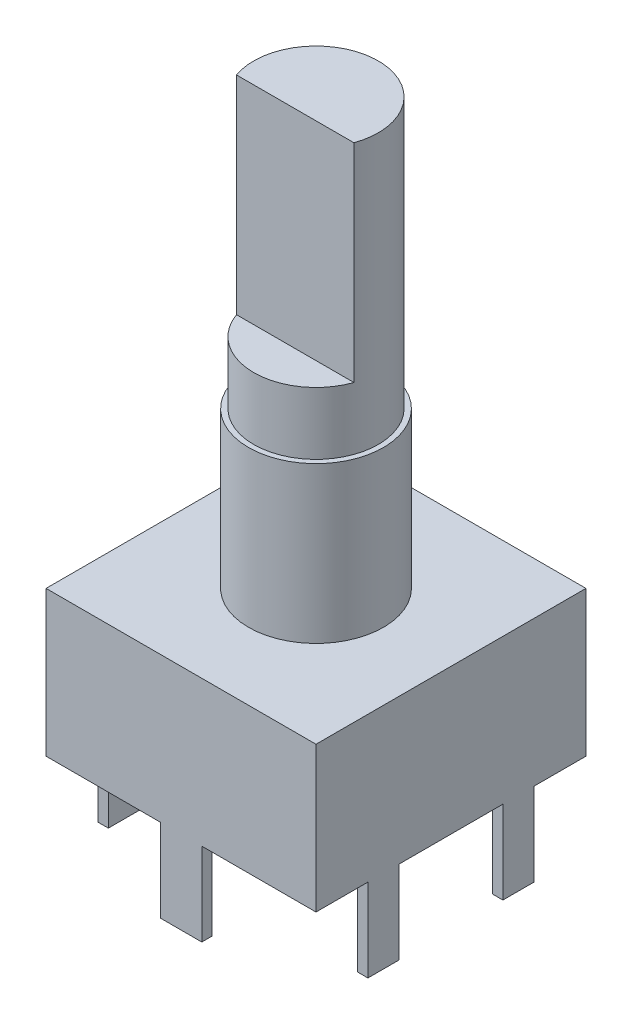
ISO-10303-21;
HEADER;
FILE_DESCRIPTION(('STEP AP214'),'2;1');
FILE_NAME('part.step','',(''),(''),'','','');
FILE_SCHEMA(('AUTOMOTIVE_DESIGN { 1 0 10303 214 1 1 1 1 }'));
ENDSEC;
DATA;
#1=APPLICATION_CONTEXT('core data for automotive mechanical design processes');
#2=APPLICATION_PROTOCOL_DEFINITION('international standard','automotive_design',2000,#1);
#3=PRODUCT_CONTEXT('',#1,'mechanical');
#4=PRODUCT('Part','Part','',(#3));
#5=PRODUCT_RELATED_PRODUCT_CATEGORY('part','',(#4));
#6=PRODUCT_DEFINITION_FORMATION('','',#4);
#7=PRODUCT_DEFINITION_CONTEXT('part definition',#1,'design');
#8=PRODUCT_DEFINITION('design','',#6,#7);
#9=PRODUCT_DEFINITION_SHAPE('','',#8);
#10=(LENGTH_UNIT() NAMED_UNIT(*) SI_UNIT(.MILLI.,.METRE.));
#11=(NAMED_UNIT(*) PLANE_ANGLE_UNIT() SI_UNIT($,.RADIAN.));
#12=(NAMED_UNIT(*) SI_UNIT($,.STERADIAN.) SOLID_ANGLE_UNIT());
#13=UNCERTAINTY_MEASURE_WITH_UNIT(LENGTH_MEASURE(1.E-05),#10,'distance_accuracy_value','');
#14=(GEOMETRIC_REPRESENTATION_CONTEXT(3) GLOBAL_UNCERTAINTY_ASSIGNED_CONTEXT((#13)) GLOBAL_UNIT_ASSIGNED_CONTEXT((#10,
#11,#12)) REPRESENTATION_CONTEXT('',''));
#15=CARTESIAN_POINT('',(0.,0.,0.));
#16=DIRECTION('',(0.,0.,1.));
#17=DIRECTION('',(1.,0.,0.));
#18=AXIS2_PLACEMENT_3D('',#15,#16,#17);
#19=CARTESIAN_POINT('',(-6.,14.5,6.));
#20=DIRECTION('',(0.,1.,0.));
#21=DIRECTION('',(0.,0.,1.));
#22=AXIS2_PLACEMENT_3D('',#19,#20,#21);
#23=PLANE('',#22);
#24=CARTESIAN_POINT('',(-6.,14.5,6.));
#25=DIRECTION('',(0.,1.,0.));
#26=DIRECTION('',(0.,0.,1.));
#27=AXIS2_PLACEMENT_3D('',#24,#25,#26);
#28=CIRCLE('',#27,3.25);
#29=CARTESIAN_POINT('',(-6.,14.5,9.25));
#30=VERTEX_POINT('',#29);
#31=EDGE_CURVE('E281',#30,#30,#28,.T.);
#32=ORIENTED_EDGE('',*,*,#31,.T.);
#33=EDGE_LOOP('',(#32));
#34=FACE_BOUND('',#33,.T.);
#35=CARTESIAN_POINT('',(-6.,14.5,6.));
#36=DIRECTION('',(0.,1.,0.));
#37=DIRECTION('',(0.,0.,1.));
#38=AXIS2_PLACEMENT_3D('',#35,#36,#37);
#39=CIRCLE('',#38,3.);
#40=CARTESIAN_POINT('',(-6.,14.5,9.));
#41=VERTEX_POINT('',#40);
#42=EDGE_CURVE('E273',#41,#41,#39,.T.);
#43=ORIENTED_EDGE('',*,*,#42,.F.);
#44=EDGE_LOOP('',(#43));
#45=FACE_BOUND('',#44,.T.);
#46=ADVANCED_FACE('F33',(#34,#45),#23,.T.);
#47=CARTESIAN_POINT('',(-12.,7.,12.));
#48=DIRECTION('',(0.,1.,0.));
#49=DIRECTION('',(0.,0.,1.));
#50=AXIS2_PLACEMENT_3D('',#47,#48,#49);
#51=PLANE('',#50);
#52=DIRECTION('',(0.,0.,-1.));
#53=VECTOR('',#52,1.);
#54=CARTESIAN_POINT('',(0.500000000000002,7.,12.5));
#55=LINE('',#54,#53);
#56=CARTESIAN_POINT('',(0.500000000000002,7.,12.5));
#57=VERTEX_POINT('',#56);
#58=CARTESIAN_POINT('',(0.500000000000002,7.,-0.5));
#59=VERTEX_POINT('',#58);
#60=EDGE_CURVE('E529',#57,#59,#55,.T.);
#61=ORIENTED_EDGE('',*,*,#60,.T.);
#62=DIRECTION('',(-1.,0.,0.));
#63=VECTOR('',#62,1.);
#64=CARTESIAN_POINT('',(0.500000000000002,7.,-0.5));
#65=LINE('',#64,#63);
#66=CARTESIAN_POINT('',(-12.5,7.,-0.5));
#67=VERTEX_POINT('',#66);
#68=EDGE_CURVE('E526',#59,#67,#65,.T.);
#69=ORIENTED_EDGE('',*,*,#68,.T.);
#70=DIRECTION('',(0.,0.,1.));
#71=VECTOR('',#70,1.);
#72=CARTESIAN_POINT('',(-12.5,7.,-0.5));
#73=LINE('',#72,#71);
#74=CARTESIAN_POINT('',(-12.5,7.,12.5));
#75=VERTEX_POINT('',#74);
#76=EDGE_CURVE('E523',#67,#75,#73,.T.);
#77=ORIENTED_EDGE('',*,*,#76,.T.);
#78=DIRECTION('',(1.,0.,0.));
#79=VECTOR('',#78,1.);
#80=CARTESIAN_POINT('',(-12.5,7.,12.5));
#81=LINE('',#80,#79);
#82=EDGE_CURVE('E515',#75,#57,#81,.T.);
#83=ORIENTED_EDGE('',*,*,#82,.T.);
#84=EDGE_LOOP('',(#61,#69,#77,#83));
#85=FACE_BOUND('',#84,.T.);
#86=CARTESIAN_POINT('',(-6.,7.,6.));
#87=DIRECTION('',(0.,1.,0.));
#88=DIRECTION('',(0.,0.,1.));
#89=AXIS2_PLACEMENT_3D('',#86,#87,#88);
#90=CIRCLE('',#89,3.25);
#91=CARTESIAN_POINT('',(-6.,7.,9.25));
#92=VERTEX_POINT('',#91);
#93=EDGE_CURVE('E278',#92,#92,#90,.T.);
#94=ORIENTED_EDGE('',*,*,#93,.F.);
#95=EDGE_LOOP('',(#94));
#96=FACE_BOUND('',#95,.T.);
#97=ADVANCED_FACE('F552',(#85,#96),#51,.T.);
#98=CARTESIAN_POINT('',(-12.,0.,12.));
#99=DIRECTION('',(0.,1.,0.));
#100=DIRECTION('',(0.,0.,1.));
#101=AXIS2_PLACEMENT_3D('',#98,#99,#100);
#102=PLANE('',#101);
#103=DIRECTION('',(0.,0.,-1.));
#104=VECTOR('',#103,1.);
#105=CARTESIAN_POINT('',(-7.,0.,0.));
#106=LINE('',#105,#104);
#107=CARTESIAN_POINT('',(-7.,0.,0.));
#108=VERTEX_POINT('',#107);
#109=CARTESIAN_POINT('',(-7.,0.,-0.5));
#110=VERTEX_POINT('',#109);
#111=EDGE_CURVE('E58',#108,#110,#106,.T.);
#112=ORIENTED_EDGE('',*,*,#111,.F.);
#113=DIRECTION('',(-1.,0.,0.));
#114=VECTOR('',#113,1.);
#115=CARTESIAN_POINT('',(-7.,0.,0.));
#116=LINE('',#115,#114);
#117=CARTESIAN_POINT('',(-5.,0.,0.));
#118=VERTEX_POINT('',#117);
#119=EDGE_CURVE('E290',#118,#108,#116,.T.);
#120=ORIENTED_EDGE('',*,*,#119,.F.);
#121=DIRECTION('',(0.,0.,1.));
#122=VECTOR('',#121,1.);
#123=CARTESIAN_POINT('',(-5.,0.,0.));
#124=LINE('',#123,#122);
#125=CARTESIAN_POINT('',(-5.,0.,-0.499999999999998));
#126=VERTEX_POINT('',#125);
#127=EDGE_CURVE('E298',#126,#118,#124,.T.);
#128=ORIENTED_EDGE('',*,*,#127,.F.);
#129=DIRECTION('',(1.,0.,0.));
#130=VECTOR('',#129,1.);
#131=CARTESIAN_POINT('',(0.500000000000002,0.,-0.5));
#132=LINE('',#131,#130);
#133=CARTESIAN_POINT('',(0.500000000000002,0.,-0.5));
#134=VERTEX_POINT('',#133);
#135=EDGE_CURVE('E43',#126,#134,#132,.T.);
#136=ORIENTED_EDGE('',*,*,#135,.T.);
#137=DIRECTION('',(0.,0.,1.));
#138=VECTOR('',#137,1.);
#139=CARTESIAN_POINT('',(0.500000000000002,0.,12.5));
#140=LINE('',#139,#138);
#141=CARTESIAN_POINT('',(0.500000000000002,0.,2.));
#142=VERTEX_POINT('',#141);
#143=EDGE_CURVE('E531',#134,#142,#140,.T.);
#144=ORIENTED_EDGE('',*,*,#143,.T.);
#145=DIRECTION('',(1.,0.,0.));
#146=VECTOR('',#145,1.);
#147=CARTESIAN_POINT('',(0.,0.,2.));
#148=LINE('',#147,#146);
#149=CARTESIAN_POINT('',(0.,0.,2.));
#150=VERTEX_POINT('',#149);
#151=EDGE_CURVE('E318',#150,#142,#148,.T.);
#152=ORIENTED_EDGE('',*,*,#151,.F.);
#153=DIRECTION('',(0.,0.,-1.));
#154=VECTOR('',#153,1.);
#155=CARTESIAN_POINT('',(0.,0.,2.));
#156=LINE('',#155,#154);
#157=CARTESIAN_POINT('',(0.,0.,3.5));
#158=VERTEX_POINT('',#157);
#159=EDGE_CURVE('E327',#158,#150,#156,.T.);
#160=ORIENTED_EDGE('',*,*,#159,.F.);
#161=DIRECTION('',(-1.,0.,0.));
#162=VECTOR('',#161,1.);
#163=CARTESIAN_POINT('',(0.5,0.,3.5));
#164=LINE('',#163,#162);
#165=CARTESIAN_POINT('',(0.5,0.,3.5));
#166=VERTEX_POINT('',#165);
#167=EDGE_CURVE('E313',#166,#158,#164,.T.);
#168=ORIENTED_EDGE('',*,*,#167,.F.);
#169=CARTESIAN_POINT('',(0.500000000000002,0.,8.5));
#170=VERTEX_POINT('',#169);
#171=EDGE_CURVE('E532',#166,#170,#140,.T.);
#172=ORIENTED_EDGE('',*,*,#171,.T.);
#173=DIRECTION('',(1.,0.,0.));
#174=VECTOR('',#173,1.);
#175=CARTESIAN_POINT('',(0.,0.,8.5));
#176=LINE('',#175,#174);
#177=CARTESIAN_POINT('',(0.,0.,8.5));
#178=VERTEX_POINT('',#177);
#179=EDGE_CURVE('E387',#178,#170,#176,.T.);
#180=ORIENTED_EDGE('',*,*,#179,.F.);
#181=DIRECTION('',(0.,0.,-1.));
#182=VECTOR('',#181,1.);
#183=CARTESIAN_POINT('',(0.,0.,8.5));
#184=LINE('',#183,#182);
#185=CARTESIAN_POINT('',(0.,0.,10.));
#186=VERTEX_POINT('',#185);
#187=EDGE_CURVE('E373',#186,#178,#184,.T.);
#188=ORIENTED_EDGE('',*,*,#187,.F.);
#189=DIRECTION('',(-1.,0.,0.));
#190=VECTOR('',#189,1.);
#191=CARTESIAN_POINT('',(0.,0.,10.));
#192=LINE('',#191,#190);
#193=CARTESIAN_POINT('',(0.5,0.,10.));
#194=VERTEX_POINT('',#193);
#195=EDGE_CURVE('E378',#194,#186,#192,.T.);
#196=ORIENTED_EDGE('',*,*,#195,.F.);
#197=CARTESIAN_POINT('',(0.500000000000002,0.,12.5));
#198=VERTEX_POINT('',#197);
#199=EDGE_CURVE('E533',#194,#198,#140,.T.);
#200=ORIENTED_EDGE('',*,*,#199,.T.);
#201=DIRECTION('',(-1.,0.,0.));
#202=VECTOR('',#201,1.);
#203=CARTESIAN_POINT('',(-12.5,0.,12.5));
#204=LINE('',#203,#202);
#205=CARTESIAN_POINT('',(-5.,0.,12.5));
#206=VERTEX_POINT('',#205);
#207=EDGE_CURVE('E504',#198,#206,#204,.T.);
#208=ORIENTED_EDGE('',*,*,#207,.T.);
#209=DIRECTION('',(0.,0.,1.));
#210=VECTOR('',#209,1.);
#211=CARTESIAN_POINT('',(-5.,0.,12.5));
#212=LINE('',#211,#210);
#213=CARTESIAN_POINT('',(-5.,0.,12.));
#214=VERTEX_POINT('',#213);
#215=EDGE_CURVE('E348',#214,#206,#212,.T.);
#216=ORIENTED_EDGE('',*,*,#215,.F.);
#217=DIRECTION('',(1.,0.,0.));
#218=VECTOR('',#217,1.);
#219=CARTESIAN_POINT('',(-5.,0.,12.));
#220=LINE('',#219,#218);
#221=CARTESIAN_POINT('',(-7.,0.,12.));
#222=VERTEX_POINT('',#221);
#223=EDGE_CURVE('E357',#222,#214,#220,.T.);
#224=ORIENTED_EDGE('',*,*,#223,.F.);
#225=DIRECTION('',(0.,0.,-1.));
#226=VECTOR('',#225,1.);
#227=CARTESIAN_POINT('',(-7.,0.,12.5));
#228=LINE('',#227,#226);
#229=CARTESIAN_POINT('',(-7.,0.,12.5));
#230=VERTEX_POINT('',#229);
#231=EDGE_CURVE('E343',#230,#222,#228,.T.);
#232=ORIENTED_EDGE('',*,*,#231,.F.);
#233=CARTESIAN_POINT('',(-12.5,0.,12.5));
#234=VERTEX_POINT('',#233);
#235=EDGE_CURVE('E511',#230,#234,#204,.T.);
#236=ORIENTED_EDGE('',*,*,#235,.T.);
#237=DIRECTION('',(0.,0.,-1.));
#238=VECTOR('',#237,1.);
#239=CARTESIAN_POINT('',(-12.5,0.,-0.5));
#240=LINE('',#239,#238);
#241=CARTESIAN_POINT('',(-12.5,0.,10.));
#242=VERTEX_POINT('',#241);
#243=EDGE_CURVE('E509',#234,#242,#240,.T.);
#244=ORIENTED_EDGE('',*,*,#243,.T.);
#245=DIRECTION('',(-1.,0.,0.));
#246=VECTOR('',#245,1.);
#247=CARTESIAN_POINT('',(-12.,0.,10.));
#248=LINE('',#247,#246);
#249=CARTESIAN_POINT('',(-12.,0.,10.));
#250=VERTEX_POINT('',#249);
#251=EDGE_CURVE('E477',#250,#242,#248,.T.);
#252=ORIENTED_EDGE('',*,*,#251,.F.);
#253=DIRECTION('',(0.,0.,1.));
#254=VECTOR('',#253,1.);
#255=CARTESIAN_POINT('',(-12.,0.,10.));
#256=LINE('',#255,#254);
#257=CARTESIAN_POINT('',(-12.,0.,8.5));
#258=VERTEX_POINT('',#257);
#259=EDGE_CURVE('E463',#258,#250,#256,.T.);
#260=ORIENTED_EDGE('',*,*,#259,.F.);
#261=DIRECTION('',(1.,0.,0.));
#262=VECTOR('',#261,1.);
#263=CARTESIAN_POINT('',(-12.,0.,8.5));
#264=LINE('',#263,#262);
#265=CARTESIAN_POINT('',(-12.5,0.,8.5));
#266=VERTEX_POINT('',#265);
#267=EDGE_CURVE('E468',#266,#258,#264,.T.);
#268=ORIENTED_EDGE('',*,*,#267,.F.);
#269=CARTESIAN_POINT('',(-12.5,0.,6.793));
#270=VERTEX_POINT('',#269);
#271=EDGE_CURVE('E485',#266,#270,#240,.T.);
#272=ORIENTED_EDGE('',*,*,#271,.T.);
#273=DIRECTION('',(-1.,0.,0.));
#274=VECTOR('',#273,1.);
#275=CARTESIAN_POINT('',(-12.,0.,6.793));
#276=LINE('',#275,#274);
#277=CARTESIAN_POINT('',(-12.,0.,6.793));
#278=VERTEX_POINT('',#277);
#279=EDGE_CURVE('E447',#278,#270,#276,.T.);
#280=ORIENTED_EDGE('',*,*,#279,.F.);
#281=DIRECTION('',(0.,0.,1.));
#282=VECTOR('',#281,1.);
#283=CARTESIAN_POINT('',(-12.,0.,6.793));
#284=LINE('',#283,#282);
#285=CARTESIAN_POINT('',(-12.,0.,5.293));
#286=VERTEX_POINT('',#285);
#287=EDGE_CURVE('E433',#286,#278,#284,.T.);
#288=ORIENTED_EDGE('',*,*,#287,.F.);
#289=DIRECTION('',(1.,0.,0.));
#290=VECTOR('',#289,1.);
#291=CARTESIAN_POINT('',(-12.,0.,5.293));
#292=LINE('',#291,#290);
#293=CARTESIAN_POINT('',(-12.5,0.,5.293));
#294=VERTEX_POINT('',#293);
#295=EDGE_CURVE('E438',#294,#286,#292,.T.);
#296=ORIENTED_EDGE('',*,*,#295,.F.);
#297=CARTESIAN_POINT('',(-12.5,0.,3.5));
#298=VERTEX_POINT('',#297);
#299=EDGE_CURVE('E501',#294,#298,#240,.T.);
#300=ORIENTED_EDGE('',*,*,#299,.T.);
#301=DIRECTION('',(-1.,0.,0.));
#302=VECTOR('',#301,1.);
#303=CARTESIAN_POINT('',(-12.,0.,3.5));
#304=LINE('',#303,#302);
#305=CARTESIAN_POINT('',(-12.,0.,3.5));
#306=VERTEX_POINT('',#305);
#307=EDGE_CURVE('E417',#306,#298,#304,.T.);
#308=ORIENTED_EDGE('',*,*,#307,.F.);
#309=DIRECTION('',(0.,0.,1.));
#310=VECTOR('',#309,1.);
#311=CARTESIAN_POINT('',(-12.,0.,3.5));
#312=LINE('',#311,#310);
#313=CARTESIAN_POINT('',(-12.,0.,2.));
#314=VERTEX_POINT('',#313);
#315=EDGE_CURVE('E403',#314,#306,#312,.T.);
#316=ORIENTED_EDGE('',*,*,#315,.F.);
#317=DIRECTION('',(1.,0.,0.));
#318=VECTOR('',#317,1.);
#319=CARTESIAN_POINT('',(-12.,0.,2.));
#320=LINE('',#319,#318);
#321=CARTESIAN_POINT('',(-12.5,0.,2.));
#322=VERTEX_POINT('',#321);
#323=EDGE_CURVE('E408',#322,#314,#320,.T.);
#324=ORIENTED_EDGE('',*,*,#323,.F.);
#325=CARTESIAN_POINT('',(-12.5,0.,-0.5));
#326=VERTEX_POINT('',#325);
#327=EDGE_CURVE('E37',#322,#326,#240,.T.);
#328=ORIENTED_EDGE('',*,*,#327,.T.);
#329=EDGE_CURVE('E11',#326,#110,#132,.T.);
#330=ORIENTED_EDGE('',*,*,#329,.T.);
#331=EDGE_LOOP('',(#112,#120,#128,#136,#144,#152,#160,#168,#172,#180,#188,#196,#200,#208,#216,
#224,#232,#236,#244,#252,#260,#268,#272,#280,#288,#296,#300,#308,#316,#324,#328,#330));
#332=FACE_BOUND('',#331,.T.);
#333=ADVANCED_FACE('F35',(#332),#102,.F.);
#334=CARTESIAN_POINT('',(0.500000000000002,-18.3847763108502,-0.5));
#335=DIRECTION('',(0.,0.,-1.));
#336=DIRECTION('',(-1.,0.,0.));
#337=AXIS2_PLACEMENT_3D('',#334,#335,#336);
#338=PLANE('',#337);
#339=ORIENTED_EDGE('',*,*,#329,.F.);
#340=DIRECTION('',(0.,1.,0.));
#341=VECTOR('',#340,1.);
#342=CARTESIAN_POINT('',(-12.5,-18.3847763108502,-0.5));
#343=LINE('',#342,#341);
#344=EDGE_CURVE('E514',#326,#67,#343,.T.);
#345=ORIENTED_EDGE('',*,*,#344,.T.);
#346=ORIENTED_EDGE('',*,*,#68,.F.);
#347=DIRECTION('',(0.,1.,0.));
#348=VECTOR('',#347,1.);
#349=CARTESIAN_POINT('',(0.500000000000002,-18.3847763108502,-0.5));
#350=LINE('',#349,#348);
#351=EDGE_CURVE('E512',#134,#59,#350,.T.);
#352=ORIENTED_EDGE('',*,*,#351,.F.);
#353=ORIENTED_EDGE('',*,*,#135,.F.);
#354=DIRECTION('',(0.,1.,0.));
#355=VECTOR('',#354,1.);
#356=CARTESIAN_POINT('',(-5.,-4.,-0.499999999999998));
#357=LINE('',#356,#355);
#358=CARTESIAN_POINT('',(-5.,-4.,-0.499999999999998));
#359=VERTEX_POINT('',#358);
#360=EDGE_CURVE('E307',#359,#126,#357,.T.);
#361=ORIENTED_EDGE('',*,*,#360,.F.);
#362=DIRECTION('',(1.,0.,0.));
#363=VECTOR('',#362,1.);
#364=CARTESIAN_POINT('',(-7.,-4.,-0.499999999999999));
#365=LINE('',#364,#363);
#366=CARTESIAN_POINT('',(-7.,-4.,-0.499999999999999));
#367=VERTEX_POINT('',#366);
#368=EDGE_CURVE('E289',#367,#359,#365,.T.);
#369=ORIENTED_EDGE('',*,*,#368,.F.);
#370=DIRECTION('',(0.,1.,0.));
#371=VECTOR('',#370,1.);
#372=CARTESIAN_POINT('',(-7.,-4.,-0.499999999999999));
#373=LINE('',#372,#371);
#374=EDGE_CURVE('E310',#367,#110,#373,.T.);
#375=ORIENTED_EDGE('',*,*,#374,.T.);
#376=EDGE_LOOP('',(#339,#345,#346,#352,#353,#361,#369,#375));
#377=FACE_BOUND('',#376,.T.);
#378=ADVANCED_FACE('F560',(#377),#338,.T.);
#379=CARTESIAN_POINT('',(-12.5,-18.3847763108502,-0.5));
#380=DIRECTION('',(-1.,0.,0.));
#381=DIRECTION('',(0.,0.,1.));
#382=AXIS2_PLACEMENT_3D('',#379,#380,#381);
#383=PLANE('',#382);
#384=ORIENTED_EDGE('',*,*,#243,.F.);
#385=DIRECTION('',(0.,1.,0.));
#386=VECTOR('',#385,1.);
#387=CARTESIAN_POINT('',(-12.5,-18.3847763108502,12.5));
#388=LINE('',#387,#386);
#389=EDGE_CURVE('E517',#234,#75,#388,.T.);
#390=ORIENTED_EDGE('',*,*,#389,.T.);
#391=ORIENTED_EDGE('',*,*,#76,.F.);
#392=ORIENTED_EDGE('',*,*,#344,.F.);
#393=ORIENTED_EDGE('',*,*,#327,.F.);
#394=DIRECTION('',(0.,1.,0.));
#395=VECTOR('',#394,1.);
#396=CARTESIAN_POINT('',(-12.5,-4.,2.));
#397=LINE('',#396,#395);
#398=CARTESIAN_POINT('',(-12.5,-4.,2.));
#399=VERTEX_POINT('',#398);
#400=EDGE_CURVE('E424',#399,#322,#397,.T.);
#401=ORIENTED_EDGE('',*,*,#400,.F.);
#402=DIRECTION('',(0.,0.,-1.));
#403=VECTOR('',#402,1.);
#404=CARTESIAN_POINT('',(-12.5,-4.,3.5));
#405=LINE('',#404,#403);
#406=CARTESIAN_POINT('',(-12.5,-4.,3.5));
#407=VERTEX_POINT('',#406);
#408=EDGE_CURVE('E410',#407,#399,#405,.T.);
#409=ORIENTED_EDGE('',*,*,#408,.F.);
#410=DIRECTION('',(0.,1.,0.));
#411=VECTOR('',#410,1.);
#412=CARTESIAN_POINT('',(-12.5,-4.,3.5));
#413=LINE('',#412,#411);
#414=EDGE_CURVE('E427',#407,#298,#413,.T.);
#415=ORIENTED_EDGE('',*,*,#414,.T.);
#416=ORIENTED_EDGE('',*,*,#299,.F.);
#417=DIRECTION('',(0.,1.,0.));
#418=VECTOR('',#417,1.);
#419=CARTESIAN_POINT('',(-12.5,-4.,5.293));
#420=LINE('',#419,#418);
#421=CARTESIAN_POINT('',(-12.5,-4.,5.293));
#422=VERTEX_POINT('',#421);
#423=EDGE_CURVE('E454',#422,#294,#420,.T.);
#424=ORIENTED_EDGE('',*,*,#423,.F.);
#425=DIRECTION('',(0.,0.,-1.));
#426=VECTOR('',#425,1.);
#427=CARTESIAN_POINT('',(-12.5,-4.,6.793));
#428=LINE('',#427,#426);
#429=CARTESIAN_POINT('',(-12.5,-4.,6.793));
#430=VERTEX_POINT('',#429);
#431=EDGE_CURVE('E440',#430,#422,#428,.T.);
#432=ORIENTED_EDGE('',*,*,#431,.F.);
#433=DIRECTION('',(0.,1.,0.));
#434=VECTOR('',#433,1.);
#435=CARTESIAN_POINT('',(-12.5,-4.,6.793));
#436=LINE('',#435,#434);
#437=EDGE_CURVE('E457',#430,#270,#436,.T.);
#438=ORIENTED_EDGE('',*,*,#437,.T.);
#439=ORIENTED_EDGE('',*,*,#271,.F.);
#440=DIRECTION('',(0.,1.,0.));
#441=VECTOR('',#440,1.);
#442=CARTESIAN_POINT('',(-12.5,-4.,8.5));
#443=LINE('',#442,#441);
#444=CARTESIAN_POINT('',(-12.5,-4.,8.5));
#445=VERTEX_POINT('',#444);
#446=EDGE_CURVE('E491',#445,#266,#443,.T.);
#447=ORIENTED_EDGE('',*,*,#446,.F.);
#448=DIRECTION('',(0.,0.,-1.));
#449=VECTOR('',#448,1.);
#450=CARTESIAN_POINT('',(-12.5,-4.,10.));
#451=LINE('',#450,#449);
#452=CARTESIAN_POINT('',(-12.5,-4.,10.));
#453=VERTEX_POINT('',#452);
#454=EDGE_CURVE('E470',#453,#445,#451,.T.);
#455=ORIENTED_EDGE('',*,*,#454,.F.);
#456=DIRECTION('',(0.,1.,0.));
#457=VECTOR('',#456,1.);
#458=CARTESIAN_POINT('',(-12.5,-4.,10.));
#459=LINE('',#458,#457);
#460=EDGE_CURVE('E487',#453,#242,#459,.T.);
#461=ORIENTED_EDGE('',*,*,#460,.T.);
#462=EDGE_LOOP('',(#384,#390,#391,#392,#393,#401,#409,#415,#416,#424,#432,#438,#439,#447,#455,#461));
#463=FACE_BOUND('',#462,.T.);
#464=ADVANCED_FACE('F543',(#463),#383,.T.);
#465=CARTESIAN_POINT('',(-12.5,-18.3847763108502,12.5));
#466=DIRECTION('',(0.,0.,1.));
#467=DIRECTION('',(1.,0.,0.));
#468=AXIS2_PLACEMENT_3D('',#465,#466,#467);
#469=PLANE('',#468);
#470=ORIENTED_EDGE('',*,*,#207,.F.);
#471=DIRECTION('',(0.,1.,0.));
#472=VECTOR('',#471,1.);
#473=CARTESIAN_POINT('',(0.500000000000002,-18.3847763108502,12.5));
#474=LINE('',#473,#472);
#475=EDGE_CURVE('E519',#198,#57,#474,.T.);
#476=ORIENTED_EDGE('',*,*,#475,.T.);
#477=ORIENTED_EDGE('',*,*,#82,.F.);
#478=ORIENTED_EDGE('',*,*,#389,.F.);
#479=ORIENTED_EDGE('',*,*,#235,.F.);
#480=DIRECTION('',(0.,1.,0.));
#481=VECTOR('',#480,1.);
#482=CARTESIAN_POINT('',(-7.,-4.,12.5));
#483=LINE('',#482,#481);
#484=CARTESIAN_POINT('',(-7.,-4.,12.5));
#485=VERTEX_POINT('',#484);
#486=EDGE_CURVE('E354',#485,#230,#483,.T.);
#487=ORIENTED_EDGE('',*,*,#486,.F.);
#488=DIRECTION('',(-1.,0.,0.));
#489=VECTOR('',#488,1.);
#490=CARTESIAN_POINT('',(-5.,-4.,12.5));
#491=LINE('',#490,#489);
#492=CARTESIAN_POINT('',(-5.,-4.,12.5));
#493=VERTEX_POINT('',#492);
#494=EDGE_CURVE('E352',#493,#485,#491,.T.);
#495=ORIENTED_EDGE('',*,*,#494,.F.);
#496=DIRECTION('',(0.,1.,0.));
#497=VECTOR('',#496,1.);
#498=CARTESIAN_POINT('',(-5.,-4.,12.5));
#499=LINE('',#498,#497);
#500=EDGE_CURVE('E364',#493,#206,#499,.T.);
#501=ORIENTED_EDGE('',*,*,#500,.T.);
#502=EDGE_LOOP('',(#470,#476,#477,#478,#479,#487,#495,#501));
#503=FACE_BOUND('',#502,.T.);
#504=ADVANCED_FACE('F548',(#503),#469,.T.);
#505=CARTESIAN_POINT('',(0.500000000000002,-18.3847763108502,12.5));
#506=DIRECTION('',(1.,0.,0.));
#507=DIRECTION('',(0.,0.,-1.));
#508=AXIS2_PLACEMENT_3D('',#505,#506,#507);
#509=PLANE('',#508);
#510=ORIENTED_EDGE('',*,*,#143,.F.);
#511=ORIENTED_EDGE('',*,*,#351,.T.);
#512=ORIENTED_EDGE('',*,*,#60,.F.);
#513=ORIENTED_EDGE('',*,*,#475,.F.);
#514=ORIENTED_EDGE('',*,*,#199,.F.);
#515=DIRECTION('',(0.,1.,0.));
#516=VECTOR('',#515,1.);
#517=CARTESIAN_POINT('',(0.5,-4.,10.));
#518=LINE('',#517,#516);
#519=CARTESIAN_POINT('',(0.5,-4.,10.));
#520=VERTEX_POINT('',#519);
#521=EDGE_CURVE('E394',#520,#194,#518,.T.);
#522=ORIENTED_EDGE('',*,*,#521,.F.);
#523=DIRECTION('',(0.,0.,1.));
#524=VECTOR('',#523,1.);
#525=CARTESIAN_POINT('',(0.5,-4.,8.5));
#526=LINE('',#525,#524);
#527=CARTESIAN_POINT('',(0.5,-4.,8.5));
#528=VERTEX_POINT('',#527);
#529=EDGE_CURVE('E380',#528,#520,#526,.T.);
#530=ORIENTED_EDGE('',*,*,#529,.F.);
#531=DIRECTION('',(0.,1.,0.));
#532=VECTOR('',#531,1.);
#533=CARTESIAN_POINT('',(0.5,-4.,8.5));
#534=LINE('',#533,#532);
#535=EDGE_CURVE('E397',#528,#170,#534,.T.);
#536=ORIENTED_EDGE('',*,*,#535,.T.);
#537=ORIENTED_EDGE('',*,*,#171,.F.);
#538=DIRECTION('',(0.,1.,0.));
#539=VECTOR('',#538,1.);
#540=CARTESIAN_POINT('',(0.5,-4.,3.5));
#541=LINE('',#540,#539);
#542=CARTESIAN_POINT('',(0.5,-4.,3.5));
#543=VERTEX_POINT('',#542);
#544=EDGE_CURVE('E324',#543,#166,#541,.T.);
#545=ORIENTED_EDGE('',*,*,#544,.F.);
#546=DIRECTION('',(0.,0.,1.));
#547=VECTOR('',#546,1.);
#548=CARTESIAN_POINT('',(0.5,-4.,2.));
#549=LINE('',#548,#547);
#550=CARTESIAN_POINT('',(0.5,-4.,2.));
#551=VERTEX_POINT('',#550);
#552=EDGE_CURVE('E322',#551,#543,#549,.T.);
#553=ORIENTED_EDGE('',*,*,#552,.F.);
#554=DIRECTION('',(0.,1.,0.));
#555=VECTOR('',#554,1.);
#556=CARTESIAN_POINT('',(0.5,-4.,2.));
#557=LINE('',#556,#555);
#558=EDGE_CURVE('E334',#551,#142,#557,.T.);
#559=ORIENTED_EDGE('',*,*,#558,.T.);
#560=EDGE_LOOP('',(#510,#511,#512,#513,#514,#522,#530,#536,#537,#545,#553,#559));
#561=FACE_BOUND('',#560,.T.);
#562=ADVANCED_FACE('F605',(#561),#509,.T.);
#563=CARTESIAN_POINT('',(-12.,-4.,10.));
#564=DIRECTION('',(-1.,0.,0.));
#565=DIRECTION('',(0.,0.,1.));
#566=AXIS2_PLACEMENT_3D('',#563,#564,#565);
#567=PLANE('',#566);
#568=ORIENTED_EDGE('',*,*,#259,.T.);
#569=DIRECTION('',(0.,1.,0.));
#570=VECTOR('',#569,1.);
#571=CARTESIAN_POINT('',(-12.,-4.,10.));
#572=LINE('',#571,#570);
#573=CARTESIAN_POINT('',(-12.,-4.,10.));
#574=VERTEX_POINT('',#573);
#575=EDGE_CURVE('E490',#574,#250,#572,.T.);
#576=ORIENTED_EDGE('',*,*,#575,.F.);
#577=DIRECTION('',(0.,0.,1.));
#578=VECTOR('',#577,1.);
#579=CARTESIAN_POINT('',(-12.,-4.,10.));
#580=LINE('',#579,#578);
#581=CARTESIAN_POINT('',(-12.,-4.,8.5));
#582=VERTEX_POINT('',#581);
#583=EDGE_CURVE('E464',#582,#574,#580,.T.);
#584=ORIENTED_EDGE('',*,*,#583,.F.);
#585=DIRECTION('',(0.,1.,0.));
#586=VECTOR('',#585,1.);
#587=CARTESIAN_POINT('',(-12.,-4.,8.5));
#588=LINE('',#587,#586);
#589=EDGE_CURVE('E474',#582,#258,#588,.T.);
#590=ORIENTED_EDGE('',*,*,#589,.T.);
#591=EDGE_LOOP('',(#568,#576,#584,#590));
#592=FACE_BOUND('',#591,.T.);
#593=ADVANCED_FACE('F603',(#592),#567,.F.);
#594=CARTESIAN_POINT('',(-12.,-4.,10.));
#595=DIRECTION('',(0.,0.,-1.));
#596=DIRECTION('',(-1.,0.,0.));
#597=AXIS2_PLACEMENT_3D('',#594,#595,#596);
#598=PLANE('',#597);
#599=ORIENTED_EDGE('',*,*,#251,.T.);
#600=ORIENTED_EDGE('',*,*,#460,.F.);
#601=DIRECTION('',(-1.,0.,0.));
#602=VECTOR('',#601,1.);
#603=CARTESIAN_POINT('',(-12.,-4.,10.));
#604=LINE('',#603,#602);
#605=EDGE_CURVE('E467',#574,#453,#604,.T.);
#606=ORIENTED_EDGE('',*,*,#605,.F.);
#607=ORIENTED_EDGE('',*,*,#575,.T.);
#608=EDGE_LOOP('',(#599,#600,#606,#607));
#609=FACE_BOUND('',#608,.T.);
#610=ADVANCED_FACE('F601',(#609),#598,.F.);
#611=CARTESIAN_POINT('',(-12.,-4.,8.5));
#612=DIRECTION('',(0.,0.,1.));
#613=DIRECTION('',(1.,0.,0.));
#614=AXIS2_PLACEMENT_3D('',#611,#612,#613);
#615=PLANE('',#614);
#616=ORIENTED_EDGE('',*,*,#267,.T.);
#617=ORIENTED_EDGE('',*,*,#589,.F.);
#618=DIRECTION('',(1.,0.,0.));
#619=VECTOR('',#618,1.);
#620=CARTESIAN_POINT('',(-12.,-4.,8.5));
#621=LINE('',#620,#619);
#622=EDGE_CURVE('E472',#445,#582,#621,.T.);
#623=ORIENTED_EDGE('',*,*,#622,.F.);
#624=ORIENTED_EDGE('',*,*,#446,.T.);
#625=EDGE_LOOP('',(#616,#617,#623,#624));
#626=FACE_BOUND('',#625,.T.);
#627=ADVANCED_FACE('F592',(#626),#615,.F.);
#628=CARTESIAN_POINT('',(-12.,-4.,8.5));
#629=DIRECTION('',(0.,1.,0.));
#630=DIRECTION('',(0.,0.,1.));
#631=AXIS2_PLACEMENT_3D('',#628,#629,#630);
#632=PLANE('',#631);
#633=ORIENTED_EDGE('',*,*,#583,.T.);
#634=ORIENTED_EDGE('',*,*,#605,.T.);
#635=ORIENTED_EDGE('',*,*,#454,.T.);
#636=ORIENTED_EDGE('',*,*,#622,.T.);
#637=EDGE_LOOP('',(#633,#634,#635,#636));
#638=FACE_BOUND('',#637,.T.);
#639=ADVANCED_FACE('F597',(#638),#632,.F.);
#640=CARTESIAN_POINT('',(-12.,-4.,6.793));
#641=DIRECTION('',(-1.,0.,0.));
#642=DIRECTION('',(0.,0.,1.));
#643=AXIS2_PLACEMENT_3D('',#640,#641,#642);
#644=PLANE('',#643);
#645=ORIENTED_EDGE('',*,*,#287,.T.);
#646=DIRECTION('',(0.,1.,0.));
#647=VECTOR('',#646,1.);
#648=CARTESIAN_POINT('',(-12.,-4.,6.793));
#649=LINE('',#648,#647);
#650=CARTESIAN_POINT('',(-12.,-4.,6.793));
#651=VERTEX_POINT('',#650);
#652=EDGE_CURVE('E460',#651,#278,#649,.T.);
#653=ORIENTED_EDGE('',*,*,#652,.F.);
#654=DIRECTION('',(0.,0.,1.));
#655=VECTOR('',#654,1.);
#656=CARTESIAN_POINT('',(-12.,-4.,6.793));
#657=LINE('',#656,#655);
#658=CARTESIAN_POINT('',(-12.,-4.,5.293));
#659=VERTEX_POINT('',#658);
#660=EDGE_CURVE('E434',#659,#651,#657,.T.);
#661=ORIENTED_EDGE('',*,*,#660,.F.);
#662=DIRECTION('',(0.,1.,0.));
#663=VECTOR('',#662,1.);
#664=CARTESIAN_POINT('',(-12.,-4.,5.293));
#665=LINE('',#664,#663);
#666=EDGE_CURVE('E444',#659,#286,#665,.T.);
#667=ORIENTED_EDGE('',*,*,#666,.T.);
#668=EDGE_LOOP('',(#645,#653,#661,#667));
#669=FACE_BOUND('',#668,.T.);
#670=ADVANCED_FACE('F709',(#669),#644,.F.);
#671=CARTESIAN_POINT('',(-12.,-4.,6.793));
#672=DIRECTION('',(0.,0.,-1.));
#673=DIRECTION('',(-1.,0.,0.));
#674=AXIS2_PLACEMENT_3D('',#671,#672,#673);
#675=PLANE('',#674);
#676=ORIENTED_EDGE('',*,*,#279,.T.);
#677=ORIENTED_EDGE('',*,*,#437,.F.);
#678=DIRECTION('',(-1.,0.,0.));
#679=VECTOR('',#678,1.);
#680=CARTESIAN_POINT('',(-12.,-4.,6.793));
#681=LINE('',#680,#679);
#682=EDGE_CURVE('E437',#651,#430,#681,.T.);
#683=ORIENTED_EDGE('',*,*,#682,.F.);
#684=ORIENTED_EDGE('',*,*,#652,.T.);
#685=EDGE_LOOP('',(#676,#677,#683,#684));
#686=FACE_BOUND('',#685,.T.);
#687=ADVANCED_FACE('F587',(#686),#675,.F.);
#688=CARTESIAN_POINT('',(-12.,-4.,5.293));
#689=DIRECTION('',(0.,0.,1.));
#690=DIRECTION('',(1.,0.,0.));
#691=AXIS2_PLACEMENT_3D('',#688,#689,#690);
#692=PLANE('',#691);
#693=ORIENTED_EDGE('',*,*,#295,.T.);
#694=ORIENTED_EDGE('',*,*,#666,.F.);
#695=DIRECTION('',(1.,0.,0.));
#696=VECTOR('',#695,1.);
#697=CARTESIAN_POINT('',(-12.,-4.,5.293));
#698=LINE('',#697,#696);
#699=EDGE_CURVE('E442',#422,#659,#698,.T.);
#700=ORIENTED_EDGE('',*,*,#699,.F.);
#701=ORIENTED_EDGE('',*,*,#423,.T.);
#702=EDGE_LOOP('',(#693,#694,#700,#701));
#703=FACE_BOUND('',#702,.T.);
#704=ADVANCED_FACE('F580',(#703),#692,.F.);
#705=CARTESIAN_POINT('',(-12.,-4.,5.293));
#706=DIRECTION('',(0.,1.,0.));
#707=DIRECTION('',(0.,0.,1.));
#708=AXIS2_PLACEMENT_3D('',#705,#706,#707);
#709=PLANE('',#708);
#710=ORIENTED_EDGE('',*,*,#660,.T.);
#711=ORIENTED_EDGE('',*,*,#682,.T.);
#712=ORIENTED_EDGE('',*,*,#431,.T.);
#713=ORIENTED_EDGE('',*,*,#699,.T.);
#714=EDGE_LOOP('',(#710,#711,#712,#713));
#715=FACE_BOUND('',#714,.T.);
#716=ADVANCED_FACE('F583',(#715),#709,.F.);
#717=CARTESIAN_POINT('',(-12.,-4.,3.5));
#718=DIRECTION('',(-1.,0.,0.));
#719=DIRECTION('',(0.,0.,1.));
#720=AXIS2_PLACEMENT_3D('',#717,#718,#719);
#721=PLANE('',#720);
#722=ORIENTED_EDGE('',*,*,#315,.T.);
#723=DIRECTION('',(0.,1.,0.));
#724=VECTOR('',#723,1.);
#725=CARTESIAN_POINT('',(-12.,-4.,3.5));
#726=LINE('',#725,#724);
#727=CARTESIAN_POINT('',(-12.,-4.,3.5));
#728=VERTEX_POINT('',#727);
#729=EDGE_CURVE('E430',#728,#306,#726,.T.);
#730=ORIENTED_EDGE('',*,*,#729,.F.);
#731=DIRECTION('',(0.,0.,1.));
#732=VECTOR('',#731,1.);
#733=CARTESIAN_POINT('',(-12.,-4.,3.5));
#734=LINE('',#733,#732);
#735=CARTESIAN_POINT('',(-12.,-4.,2.));
#736=VERTEX_POINT('',#735);
#737=EDGE_CURVE('E404',#736,#728,#734,.T.);
#738=ORIENTED_EDGE('',*,*,#737,.F.);
#739=DIRECTION('',(0.,1.,0.));
#740=VECTOR('',#739,1.);
#741=CARTESIAN_POINT('',(-12.,-4.,2.));
#742=LINE('',#741,#740);
#743=EDGE_CURVE('E414',#736,#314,#742,.T.);
#744=ORIENTED_EDGE('',*,*,#743,.T.);
#745=EDGE_LOOP('',(#722,#730,#738,#744));
#746=FACE_BOUND('',#745,.T.);
#747=ADVANCED_FACE('F699',(#746),#721,.F.);
#748=CARTESIAN_POINT('',(-12.,-4.,3.5));
#749=DIRECTION('',(0.,0.,-1.));
#750=DIRECTION('',(-1.,0.,0.));
#751=AXIS2_PLACEMENT_3D('',#748,#749,#750);
#752=PLANE('',#751);
#753=ORIENTED_EDGE('',*,*,#307,.T.);
#754=ORIENTED_EDGE('',*,*,#414,.F.);
#755=DIRECTION('',(-1.,0.,0.));
#756=VECTOR('',#755,1.);
#757=CARTESIAN_POINT('',(-12.,-4.,3.5));
#758=LINE('',#757,#756);
#759=EDGE_CURVE('E407',#728,#407,#758,.T.);
#760=ORIENTED_EDGE('',*,*,#759,.F.);
#761=ORIENTED_EDGE('',*,*,#729,.T.);
#762=EDGE_LOOP('',(#753,#754,#760,#761));
#763=FACE_BOUND('',#762,.T.);
#764=ADVANCED_FACE('F573',(#763),#752,.F.);
#765=CARTESIAN_POINT('',(-12.,-4.,2.));
#766=DIRECTION('',(0.,0.,1.));
#767=DIRECTION('',(1.,0.,0.));
#768=AXIS2_PLACEMENT_3D('',#765,#766,#767);
#769=PLANE('',#768);
#770=ORIENTED_EDGE('',*,*,#323,.T.);
#771=ORIENTED_EDGE('',*,*,#743,.F.);
#772=DIRECTION('',(1.,0.,0.));
#773=VECTOR('',#772,1.);
#774=CARTESIAN_POINT('',(-12.,-4.,2.));
#775=LINE('',#774,#773);
#776=EDGE_CURVE('E412',#399,#736,#775,.T.);
#777=ORIENTED_EDGE('',*,*,#776,.F.);
#778=ORIENTED_EDGE('',*,*,#400,.T.);
#779=EDGE_LOOP('',(#770,#771,#777,#778));
#780=FACE_BOUND('',#779,.T.);
#781=ADVANCED_FACE('F565',(#780),#769,.F.);
#782=CARTESIAN_POINT('',(-12.,-4.,2.));
#783=DIRECTION('',(0.,1.,0.));
#784=DIRECTION('',(0.,0.,1.));
#785=AXIS2_PLACEMENT_3D('',#782,#783,#784);
#786=PLANE('',#785);
#787=ORIENTED_EDGE('',*,*,#737,.T.);
#788=ORIENTED_EDGE('',*,*,#759,.T.);
#789=ORIENTED_EDGE('',*,*,#408,.T.);
#790=ORIENTED_EDGE('',*,*,#776,.T.);
#791=EDGE_LOOP('',(#787,#788,#789,#790));
#792=FACE_BOUND('',#791,.T.);
#793=ADVANCED_FACE('F569',(#792),#786,.F.);
#794=CARTESIAN_POINT('',(0.,-4.,8.5));
#795=DIRECTION('',(1.,0.,0.));
#796=DIRECTION('',(0.,0.,-1.));
#797=AXIS2_PLACEMENT_3D('',#794,#795,#796);
#798=PLANE('',#797);
#799=ORIENTED_EDGE('',*,*,#187,.T.);
#800=DIRECTION('',(0.,1.,0.));
#801=VECTOR('',#800,1.);
#802=CARTESIAN_POINT('',(0.,-4.,8.5));
#803=LINE('',#802,#801);
#804=CARTESIAN_POINT('',(0.,-4.,8.5));
#805=VERTEX_POINT('',#804);
#806=EDGE_CURVE('E400',#805,#178,#803,.T.);
#807=ORIENTED_EDGE('',*,*,#806,.F.);
#808=DIRECTION('',(0.,0.,-1.));
#809=VECTOR('',#808,1.);
#810=CARTESIAN_POINT('',(0.,-4.,8.5));
#811=LINE('',#810,#809);
#812=CARTESIAN_POINT('',(0.,-4.,10.));
#813=VERTEX_POINT('',#812);
#814=EDGE_CURVE('E374',#813,#805,#811,.T.);
#815=ORIENTED_EDGE('',*,*,#814,.F.);
#816=DIRECTION('',(0.,1.,0.));
#817=VECTOR('',#816,1.);
#818=CARTESIAN_POINT('',(0.,-4.,10.));
#819=LINE('',#818,#817);
#820=EDGE_CURVE('E384',#813,#186,#819,.T.);
#821=ORIENTED_EDGE('',*,*,#820,.T.);
#822=EDGE_LOOP('',(#799,#807,#815,#821));
#823=FACE_BOUND('',#822,.T.);
#824=ADVANCED_FACE('F688',(#823),#798,.F.);
#825=CARTESIAN_POINT('',(0.,-4.,8.5));
#826=DIRECTION('',(0.,0.,1.));
#827=DIRECTION('',(1.,0.,0.));
#828=AXIS2_PLACEMENT_3D('',#825,#826,#827);
#829=PLANE('',#828);
#830=ORIENTED_EDGE('',*,*,#179,.T.);
#831=ORIENTED_EDGE('',*,*,#535,.F.);
#832=DIRECTION('',(1.,0.,0.));
#833=VECTOR('',#832,1.);
#834=CARTESIAN_POINT('',(0.,-4.,8.5));
#835=LINE('',#834,#833);
#836=EDGE_CURVE('E377',#805,#528,#835,.T.);
#837=ORIENTED_EDGE('',*,*,#836,.F.);
#838=ORIENTED_EDGE('',*,*,#806,.T.);
#839=EDGE_LOOP('',(#830,#831,#837,#838));
#840=FACE_BOUND('',#839,.T.);
#841=ADVANCED_FACE('F684',(#840),#829,.F.);
#842=CARTESIAN_POINT('',(0.,-4.,10.));
#843=DIRECTION('',(0.,0.,-1.));
#844=DIRECTION('',(-1.,0.,0.));
#845=AXIS2_PLACEMENT_3D('',#842,#843,#844);
#846=PLANE('',#845);
#847=ORIENTED_EDGE('',*,*,#195,.T.);
#848=ORIENTED_EDGE('',*,*,#820,.F.);
#849=DIRECTION('',(-1.,0.,0.));
#850=VECTOR('',#849,1.);
#851=CARTESIAN_POINT('',(0.,-4.,10.));
#852=LINE('',#851,#850);
#853=EDGE_CURVE('E382',#520,#813,#852,.T.);
#854=ORIENTED_EDGE('',*,*,#853,.F.);
#855=ORIENTED_EDGE('',*,*,#521,.T.);
#856=EDGE_LOOP('',(#847,#848,#854,#855));
#857=FACE_BOUND('',#856,.T.);
#858=ADVANCED_FACE('F680',(#857),#846,.F.);
#859=CARTESIAN_POINT('',(0.,-4.,10.));
#860=DIRECTION('',(0.,1.,0.));
#861=DIRECTION('',(0.,0.,1.));
#862=AXIS2_PLACEMENT_3D('',#859,#860,#861);
#863=PLANE('',#862);
#864=ORIENTED_EDGE('',*,*,#814,.T.);
#865=ORIENTED_EDGE('',*,*,#836,.T.);
#866=ORIENTED_EDGE('',*,*,#529,.T.);
#867=ORIENTED_EDGE('',*,*,#853,.T.);
#868=EDGE_LOOP('',(#864,#865,#866,#867));
#869=FACE_BOUND('',#868,.T.);
#870=ADVANCED_FACE('F676',(#869),#863,.F.);
#871=CARTESIAN_POINT('',(-7.,-4.,12.5));
#872=DIRECTION('',(1.,0.,0.));
#873=DIRECTION('',(0.,0.,-1.));
#874=AXIS2_PLACEMENT_3D('',#871,#872,#873);
#875=PLANE('',#874);
#876=ORIENTED_EDGE('',*,*,#231,.T.);
#877=DIRECTION('',(0.,1.,0.));
#878=VECTOR('',#877,1.);
#879=CARTESIAN_POINT('',(-7.,-4.,12.));
#880=LINE('',#879,#878);
#881=CARTESIAN_POINT('',(-7.,-4.,12.));
#882=VERTEX_POINT('',#881);
#883=EDGE_CURVE('E370',#882,#222,#880,.T.);
#884=ORIENTED_EDGE('',*,*,#883,.F.);
#885=DIRECTION('',(0.,0.,-1.));
#886=VECTOR('',#885,1.);
#887=CARTESIAN_POINT('',(-7.,-4.,12.5));
#888=LINE('',#887,#886);
#889=EDGE_CURVE('E344',#485,#882,#888,.T.);
#890=ORIENTED_EDGE('',*,*,#889,.F.);
#891=ORIENTED_EDGE('',*,*,#486,.T.);
#892=EDGE_LOOP('',(#876,#884,#890,#891));
#893=FACE_BOUND('',#892,.T.);
#894=ADVANCED_FACE('F672',(#893),#875,.F.);
#895=CARTESIAN_POINT('',(-5.,-4.,12.));
#896=DIRECTION('',(0.,0.,1.));
#897=DIRECTION('',(1.,0.,0.));
#898=AXIS2_PLACEMENT_3D('',#895,#896,#897);
#899=PLANE('',#898);
#900=ORIENTED_EDGE('',*,*,#223,.T.);
#901=DIRECTION('',(0.,1.,0.));
#902=VECTOR('',#901,1.);
#903=CARTESIAN_POINT('',(-5.,-4.,12.));
#904=LINE('',#903,#902);
#905=CARTESIAN_POINT('',(-5.,-4.,12.));
#906=VERTEX_POINT('',#905);
#907=EDGE_CURVE('E367',#906,#214,#904,.T.);
#908=ORIENTED_EDGE('',*,*,#907,.F.);
#909=DIRECTION('',(1.,0.,0.));
#910=VECTOR('',#909,1.);
#911=CARTESIAN_POINT('',(-5.,-4.,12.));
#912=LINE('',#911,#910);
#913=EDGE_CURVE('E347',#882,#906,#912,.T.);
#914=ORIENTED_EDGE('',*,*,#913,.F.);
#915=ORIENTED_EDGE('',*,*,#883,.T.);
#916=EDGE_LOOP('',(#900,#908,#914,#915));
#917=FACE_BOUND('',#916,.T.);
#918=ADVANCED_FACE('F668',(#917),#899,.F.);
#919=CARTESIAN_POINT('',(-5.,-4.,12.5));
#920=DIRECTION('',(-1.,0.,0.));
#921=DIRECTION('',(0.,0.,1.));
#922=AXIS2_PLACEMENT_3D('',#919,#920,#921);
#923=PLANE('',#922);
#924=ORIENTED_EDGE('',*,*,#215,.T.);
#925=ORIENTED_EDGE('',*,*,#500,.F.);
#926=DIRECTION('',(0.,0.,1.));
#927=VECTOR('',#926,1.);
#928=CARTESIAN_POINT('',(-5.,-4.,12.5));
#929=LINE('',#928,#927);
#930=EDGE_CURVE('E350',#906,#493,#929,.T.);
#931=ORIENTED_EDGE('',*,*,#930,.F.);
#932=ORIENTED_EDGE('',*,*,#907,.T.);
#933=EDGE_LOOP('',(#924,#925,#931,#932));
#934=FACE_BOUND('',#933,.T.);
#935=ADVANCED_FACE('F664',(#934),#923,.F.);
#936=CARTESIAN_POINT('',(-7.,-4.,12.));
#937=DIRECTION('',(0.,1.,0.));
#938=DIRECTION('',(0.,0.,1.));
#939=AXIS2_PLACEMENT_3D('',#936,#937,#938);
#940=PLANE('',#939);
#941=ORIENTED_EDGE('',*,*,#889,.T.);
#942=ORIENTED_EDGE('',*,*,#913,.T.);
#943=ORIENTED_EDGE('',*,*,#930,.T.);
#944=ORIENTED_EDGE('',*,*,#494,.T.);
#945=EDGE_LOOP('',(#941,#942,#943,#944));
#946=FACE_BOUND('',#945,.T.);
#947=ADVANCED_FACE('F660',(#946),#940,.F.);
#948=CARTESIAN_POINT('',(0.5,-4.,3.5));
#949=DIRECTION('',(0.,0.,-1.));
#950=DIRECTION('',(-1.,0.,0.));
#951=AXIS2_PLACEMENT_3D('',#948,#949,#950);
#952=PLANE('',#951);
#953=ORIENTED_EDGE('',*,*,#167,.T.);
#954=DIRECTION('',(0.,1.,0.));
#955=VECTOR('',#954,1.);
#956=CARTESIAN_POINT('',(0.,-4.,3.5));
#957=LINE('',#956,#955);
#958=CARTESIAN_POINT('',(0.,-4.,3.5));
#959=VERTEX_POINT('',#958);
#960=EDGE_CURVE('E340',#959,#158,#957,.T.);
#961=ORIENTED_EDGE('',*,*,#960,.F.);
#962=DIRECTION('',(-1.,0.,0.));
#963=VECTOR('',#962,1.);
#964=CARTESIAN_POINT('',(0.5,-4.,3.5));
#965=LINE('',#964,#963);
#966=EDGE_CURVE('E314',#543,#959,#965,.T.);
#967=ORIENTED_EDGE('',*,*,#966,.F.);
#968=ORIENTED_EDGE('',*,*,#544,.T.);
#969=EDGE_LOOP('',(#953,#961,#967,#968));
#970=FACE_BOUND('',#969,.T.);
#971=ADVANCED_FACE('F656',(#970),#952,.F.);
#972=CARTESIAN_POINT('',(0.,-4.,2.));
#973=DIRECTION('',(1.,0.,0.));
#974=DIRECTION('',(0.,0.,-1.));
#975=AXIS2_PLACEMENT_3D('',#972,#973,#974);
#976=PLANE('',#975);
#977=ORIENTED_EDGE('',*,*,#159,.T.);
#978=DIRECTION('',(0.,1.,0.));
#979=VECTOR('',#978,1.);
#980=CARTESIAN_POINT('',(0.,-4.,2.));
#981=LINE('',#980,#979);
#982=CARTESIAN_POINT('',(0.,-4.,2.));
#983=VERTEX_POINT('',#982);
#984=EDGE_CURVE('E337',#983,#150,#981,.T.);
#985=ORIENTED_EDGE('',*,*,#984,.F.);
#986=DIRECTION('',(0.,0.,-1.));
#987=VECTOR('',#986,1.);
#988=CARTESIAN_POINT('',(0.,-4.,2.));
#989=LINE('',#988,#987);
#990=EDGE_CURVE('E317',#959,#983,#989,.T.);
#991=ORIENTED_EDGE('',*,*,#990,.F.);
#992=ORIENTED_EDGE('',*,*,#960,.T.);
#993=EDGE_LOOP('',(#977,#985,#991,#992));
#994=FACE_BOUND('',#993,.T.);
#995=ADVANCED_FACE('F652',(#994),#976,.F.);
#996=CARTESIAN_POINT('',(0.,-4.,2.));
#997=DIRECTION('',(0.,0.,1.));
#998=DIRECTION('',(1.,0.,0.));
#999=AXIS2_PLACEMENT_3D('',#996,#997,#998);
#1000=PLANE('',#999);
#1001=ORIENTED_EDGE('',*,*,#151,.T.);
#1002=ORIENTED_EDGE('',*,*,#558,.F.);
#1003=DIRECTION('',(1.,0.,0.));
#1004=VECTOR('',#1003,1.);
#1005=CARTESIAN_POINT('',(0.,-4.,2.));
#1006=LINE('',#1005,#1004);
#1007=EDGE_CURVE('E320',#983,#551,#1006,.T.);
#1008=ORIENTED_EDGE('',*,*,#1007,.F.);
#1009=ORIENTED_EDGE('',*,*,#984,.T.);
#1010=EDGE_LOOP('',(#1001,#1002,#1008,#1009));
#1011=FACE_BOUND('',#1010,.T.);
#1012=ADVANCED_FACE('F648',(#1011),#1000,.F.);
#1013=CARTESIAN_POINT('',(0.,-4.,3.5));
#1014=DIRECTION('',(0.,1.,0.));
#1015=DIRECTION('',(0.,0.,1.));
#1016=AXIS2_PLACEMENT_3D('',#1013,#1014,#1015);
#1017=PLANE('',#1016);
#1018=ORIENTED_EDGE('',*,*,#966,.T.);
#1019=ORIENTED_EDGE('',*,*,#990,.T.);
#1020=ORIENTED_EDGE('',*,*,#1007,.T.);
#1021=ORIENTED_EDGE('',*,*,#552,.T.);
#1022=EDGE_LOOP('',(#1018,#1019,#1020,#1021));
#1023=FACE_BOUND('',#1022,.T.);
#1024=ADVANCED_FACE('F644',(#1023),#1017,.F.);
#1025=CARTESIAN_POINT('',(-7.,-4.,0.));
#1026=DIRECTION('',(1.,0.,0.));
#1027=DIRECTION('',(0.,0.,-1.));
#1028=AXIS2_PLACEMENT_3D('',#1025,#1026,#1027);
#1029=PLANE('',#1028);
#1030=ORIENTED_EDGE('',*,*,#111,.T.);
#1031=ORIENTED_EDGE('',*,*,#374,.F.);
#1032=DIRECTION('',(0.,0.,-1.));
#1033=VECTOR('',#1032,1.);
#1034=CARTESIAN_POINT('',(-7.,-4.,0.));
#1035=LINE('',#1034,#1033);
#1036=CARTESIAN_POINT('',(-7.,-4.,0.));
#1037=VERTEX_POINT('',#1036);
#1038=EDGE_CURVE('E286',#1037,#367,#1035,.T.);
#1039=ORIENTED_EDGE('',*,*,#1038,.F.);
#1040=DIRECTION('',(0.,1.,0.));
#1041=VECTOR('',#1040,1.);
#1042=CARTESIAN_POINT('',(-7.,-4.,0.));
#1043=LINE('',#1042,#1041);
#1044=EDGE_CURVE('E296',#1037,#108,#1043,.T.);
#1045=ORIENTED_EDGE('',*,*,#1044,.T.);
#1046=EDGE_LOOP('',(#1030,#1031,#1039,#1045));
#1047=FACE_BOUND('',#1046,.T.);
#1048=ADVANCED_FACE('F640',(#1047),#1029,.F.);
#1049=CARTESIAN_POINT('',(-5.,-4.,0.));
#1050=DIRECTION('',(-1.,0.,0.));
#1051=DIRECTION('',(0.,0.,1.));
#1052=AXIS2_PLACEMENT_3D('',#1049,#1050,#1051);
#1053=PLANE('',#1052);
#1054=ORIENTED_EDGE('',*,*,#127,.T.);
#1055=DIRECTION('',(0.,1.,0.));
#1056=VECTOR('',#1055,1.);
#1057=CARTESIAN_POINT('',(-5.,-4.,0.));
#1058=LINE('',#1057,#1056);
#1059=CARTESIAN_POINT('',(-5.,-4.,0.));
#1060=VERTEX_POINT('',#1059);
#1061=EDGE_CURVE('E304',#1060,#118,#1058,.T.);
#1062=ORIENTED_EDGE('',*,*,#1061,.F.);
#1063=DIRECTION('',(0.,0.,1.));
#1064=VECTOR('',#1063,1.);
#1065=CARTESIAN_POINT('',(-5.,-4.,0.));
#1066=LINE('',#1065,#1064);
#1067=EDGE_CURVE('E292',#359,#1060,#1066,.T.);
#1068=ORIENTED_EDGE('',*,*,#1067,.F.);
#1069=ORIENTED_EDGE('',*,*,#360,.T.);
#1070=EDGE_LOOP('',(#1054,#1062,#1068,#1069));
#1071=FACE_BOUND('',#1070,.T.);
#1072=ADVANCED_FACE('F636',(#1071),#1053,.F.);
#1073=CARTESIAN_POINT('',(-7.,-4.,0.));
#1074=DIRECTION('',(0.,0.,-1.));
#1075=DIRECTION('',(-1.,0.,0.));
#1076=AXIS2_PLACEMENT_3D('',#1073,#1074,#1075);
#1077=PLANE('',#1076);
#1078=ORIENTED_EDGE('',*,*,#119,.T.);
#1079=ORIENTED_EDGE('',*,*,#1044,.F.);
#1080=DIRECTION('',(-1.,0.,0.));
#1081=VECTOR('',#1080,1.);
#1082=CARTESIAN_POINT('',(-7.,-4.,0.));
#1083=LINE('',#1082,#1081);
#1084=EDGE_CURVE('E294',#1060,#1037,#1083,.T.);
#1085=ORIENTED_EDGE('',*,*,#1084,.F.);
#1086=ORIENTED_EDGE('',*,*,#1061,.T.);
#1087=EDGE_LOOP('',(#1078,#1079,#1085,#1086));
#1088=FACE_BOUND('',#1087,.T.);
#1089=ADVANCED_FACE('F632',(#1088),#1077,.F.);
#1090=CARTESIAN_POINT('',(-7.,-4.,-0.499999999999999));
#1091=DIRECTION('',(0.,-1.,0.));
#1092=DIRECTION('',(0.,0.,-1.));
#1093=AXIS2_PLACEMENT_3D('',#1090,#1091,#1092);
#1094=PLANE('',#1093);
#1095=ORIENTED_EDGE('',*,*,#1038,.T.);
#1096=ORIENTED_EDGE('',*,*,#368,.T.);
#1097=ORIENTED_EDGE('',*,*,#1067,.T.);
#1098=ORIENTED_EDGE('',*,*,#1084,.T.);
#1099=EDGE_LOOP('',(#1095,#1096,#1097,#1098));
#1100=FACE_BOUND('',#1099,.T.);
#1101=ADVANCED_FACE('F628',(#1100),#1094,.T.);
#1102=CARTESIAN_POINT('',(-6.,14.5,6.));
#1103=DIRECTION('',(0.,-1.,0.));
#1104=DIRECTION('',(0.,0.,-1.));
#1105=AXIS2_PLACEMENT_3D('',#1102,#1103,#1104);
#1106=CYLINDRICAL_SURFACE('',#1105,3.25);
#1107=ORIENTED_EDGE('',*,*,#31,.F.);
#1108=EDGE_LOOP('',(#1107));
#1109=FACE_BOUND('',#1108,.T.);
#1110=ORIENTED_EDGE('',*,*,#93,.T.);
#1111=EDGE_LOOP('',(#1110));
#1112=FACE_BOUND('',#1111,.T.);
#1113=ADVANCED_FACE('F625',(#1109,#1112),#1106,.T.);
#1114=CARTESIAN_POINT('',(-6.,27.5,6.));
#1115=DIRECTION('',(0.,-1.,0.));
#1116=DIRECTION('',(0.,0.,-1.));
#1117=AXIS2_PLACEMENT_3D('',#1114,#1115,#1116);
#1118=CYLINDRICAL_SURFACE('',#1117,3.);
#1119=CARTESIAN_POINT('',(-6.,27.5,6.));
#1120=DIRECTION('',(0.,1.,0.));
#1121=DIRECTION('',(0.,0.,1.));
#1122=AXIS2_PLACEMENT_3D('',#1119,#1120,#1121);
#1123=CIRCLE('',#1122,3.);
#1124=CARTESIAN_POINT('',(-3.17157287525381,27.5,7.));
#1125=VERTEX_POINT('',#1124);
#1126=CARTESIAN_POINT('',(-8.82842712474619,27.5,7.));
#1127=VERTEX_POINT('',#1126);
#1128=EDGE_CURVE('E271',#1125,#1127,#1123,.T.);
#1129=ORIENTED_EDGE('',*,*,#1128,.F.);
#1130=DIRECTION('',(0.,1.,0.));
#1131=VECTOR('',#1130,1.);
#1132=CARTESIAN_POINT('',(-3.17157287525381,17.5,7.));
#1133=LINE('',#1132,#1131);
#1134=CARTESIAN_POINT('',(-3.17157287525381,17.5,7.));
#1135=VERTEX_POINT('',#1134);
#1136=EDGE_CURVE('E51',#1135,#1125,#1133,.T.);
#1137=ORIENTED_EDGE('',*,*,#1136,.F.);
#1138=CARTESIAN_POINT('',(-6.,17.5,6.));
#1139=DIRECTION('',(0.,1.,0.));
#1140=DIRECTION('',(0.,0.,1.));
#1141=AXIS2_PLACEMENT_3D('',#1138,#1139,#1140);
#1142=CIRCLE('',#1141,3.);
#1143=CARTESIAN_POINT('',(-8.82842712474619,17.5,7.));
#1144=VERTEX_POINT('',#1143);
#1145=EDGE_CURVE('E257',#1144,#1135,#1142,.T.);
#1146=ORIENTED_EDGE('',*,*,#1145,.F.);
#1147=DIRECTION('',(0.,1.,0.));
#1148=VECTOR('',#1147,1.);
#1149=CARTESIAN_POINT('',(-8.82842712474619,17.5,7.));
#1150=LINE('',#1149,#1148);
#1151=EDGE_CURVE('E265',#1144,#1127,#1150,.T.);
#1152=ORIENTED_EDGE('',*,*,#1151,.T.);
#1153=EDGE_LOOP('',(#1129,#1137,#1146,#1152));
#1154=FACE_BOUND('',#1153,.T.);
#1155=ORIENTED_EDGE('',*,*,#42,.T.);
#1156=EDGE_LOOP('',(#1155));
#1157=FACE_BOUND('',#1156,.T.);
#1158=ADVANCED_FACE('F268',(#1154,#1157),#1118,.T.);
#1159=CARTESIAN_POINT('',(-6.,27.5,6.));
#1160=DIRECTION('',(0.,1.,0.));
#1161=DIRECTION('',(0.,0.,1.));
#1162=AXIS2_PLACEMENT_3D('',#1159,#1160,#1161);
#1163=PLANE('',#1162);
#1164=DIRECTION('',(-1.,0.,0.));
#1165=VECTOR('',#1164,1.);
#1166=CARTESIAN_POINT('',(-8.82842712474619,27.5,7.));
#1167=LINE('',#1166,#1165);
#1168=EDGE_CURVE('E262',#1125,#1127,#1167,.T.);
#1169=ORIENTED_EDGE('',*,*,#1168,.F.);
#1170=ORIENTED_EDGE('',*,*,#1128,.T.);
#1171=EDGE_LOOP('',(#1169,#1170));
#1172=FACE_BOUND('',#1171,.T.);
#1173=ADVANCED_FACE('F831',(#1172),#1163,.T.);
#1174=CARTESIAN_POINT('',(-8.82842712474619,17.5,7.));
#1175=DIRECTION('',(0.,0.,-1.));
#1176=DIRECTION('',(-1.,0.,0.));
#1177=AXIS2_PLACEMENT_3D('',#1174,#1175,#1176);
#1178=PLANE('',#1177);
#1179=ORIENTED_EDGE('',*,*,#1168,.T.);
#1180=ORIENTED_EDGE('',*,*,#1151,.F.);
#1181=DIRECTION('',(-1.,0.,0.));
#1182=VECTOR('',#1181,1.);
#1183=CARTESIAN_POINT('',(-8.82842712474619,17.5,7.));
#1184=LINE('',#1183,#1182);
#1185=EDGE_CURVE('E259',#1135,#1144,#1184,.T.);
#1186=ORIENTED_EDGE('',*,*,#1185,.F.);
#1187=ORIENTED_EDGE('',*,*,#1136,.T.);
#1188=EDGE_LOOP('',(#1179,#1180,#1186,#1187));
#1189=FACE_BOUND('',#1188,.T.);
#1190=ADVANCED_FACE('F264',(#1189),#1178,.F.);
#1191=CARTESIAN_POINT('',(-6.,17.5,6.));
#1192=DIRECTION('',(0.,1.,0.));
#1193=DIRECTION('',(0.,0.,1.));
#1194=AXIS2_PLACEMENT_3D('',#1191,#1192,#1193);
#1195=PLANE('',#1194);
#1196=ORIENTED_EDGE('',*,*,#1145,.T.);
#1197=ORIENTED_EDGE('',*,*,#1185,.T.);
#1198=EDGE_LOOP('',(#1196,#1197));
#1199=FACE_BOUND('',#1198,.T.);
#1200=ADVANCED_FACE('F258',(#1199),#1195,.T.);
#1201=CLOSED_SHELL('',(#46,#97,#333,#378,#464,#504,#562,#593,#610,#627,#639,#670,#687,#704,#716,
#747,#764,#781,#793,#824,#841,#858,#870,#894,#918,#935,#947,#971,#995,#1012,#1024,#1048,#1072,
#1089,#1101,#1113,#1158,#1173,#1190,#1200));
#1202=MANIFOLD_SOLID_BREP('B2',#1201);
#1203=ADVANCED_BREP_SHAPE_REPRESENTATION('',(#18,#1202),#14);
#1204=SHAPE_DEFINITION_REPRESENTATION(#9,#1203);
ENDSEC;
END-ISO-10303-21;
